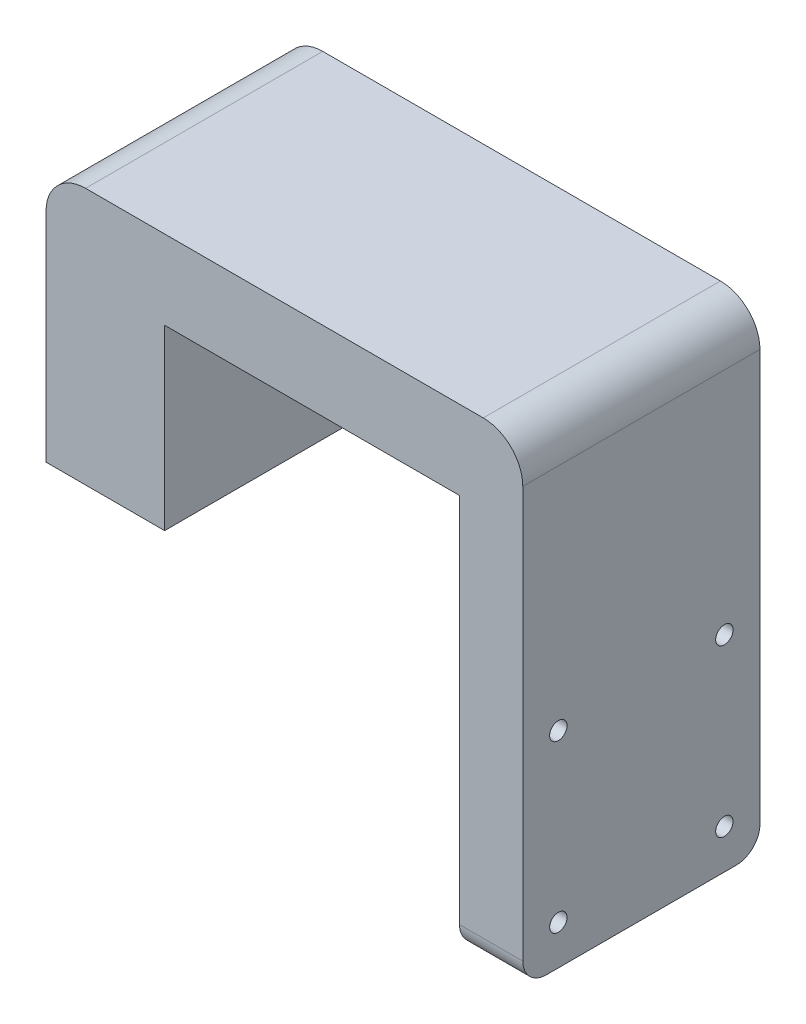
ISO-10303-21;
HEADER;
FILE_DESCRIPTION(('STEP AP214'),'2;1');
FILE_NAME('part.step','',(''),(''),'','','');
FILE_SCHEMA(('AUTOMOTIVE_DESIGN { 1 0 10303 214 1 1 1 1 }'));
ENDSEC;
DATA;
#1=APPLICATION_CONTEXT('core data for automotive mechanical design processes');
#2=APPLICATION_PROTOCOL_DEFINITION('international standard','automotive_design',2000,#1);
#3=PRODUCT_CONTEXT('',#1,'mechanical');
#4=PRODUCT('Part','Part','',(#3));
#5=PRODUCT_RELATED_PRODUCT_CATEGORY('part','',(#4));
#6=PRODUCT_DEFINITION_FORMATION('','',#4);
#7=PRODUCT_DEFINITION_CONTEXT('part definition',#1,'design');
#8=PRODUCT_DEFINITION('design','',#6,#7);
#9=PRODUCT_DEFINITION_SHAPE('','',#8);
#10=(LENGTH_UNIT() NAMED_UNIT(*) SI_UNIT(.MILLI.,.METRE.));
#11=(NAMED_UNIT(*) PLANE_ANGLE_UNIT() SI_UNIT($,.RADIAN.));
#12=(NAMED_UNIT(*) SI_UNIT($,.STERADIAN.) SOLID_ANGLE_UNIT());
#13=UNCERTAINTY_MEASURE_WITH_UNIT(LENGTH_MEASURE(1.E-05),#10,'distance_accuracy_value','');
#14=(GEOMETRIC_REPRESENTATION_CONTEXT(3) GLOBAL_UNCERTAINTY_ASSIGNED_CONTEXT((#13)) GLOBAL_UNIT_ASSIGNED_CONTEXT((#10,
#11,#12)) REPRESENTATION_CONTEXT('',''));
#15=CARTESIAN_POINT('',(0.,0.,0.));
#16=DIRECTION('',(0.,0.,1.));
#17=DIRECTION('',(1.,0.,0.));
#18=AXIS2_PLACEMENT_3D('',#15,#16,#17);
#19=CARTESIAN_POINT('',(45.3,-22.5,4.5));
#20=DIRECTION('',(-1.,0.,0.));
#21=DIRECTION('',(0.,-1.,0.));
#22=AXIS2_PLACEMENT_3D('',#19,#20,#21);
#23=CYLINDRICAL_SURFACE('',#22,1.1);
#24=CARTESIAN_POINT('',(45.3,-22.5,4.5));
#25=DIRECTION('',(-1.,0.,0.));
#26=DIRECTION('',(0.,-1.,0.));
#27=AXIS2_PLACEMENT_3D('',#24,#25,#26);
#28=CIRCLE('',#27,1.1);
#29=CARTESIAN_POINT('',(45.3,-23.6,4.5));
#30=VERTEX_POINT('',#29);
#31=EDGE_CURVE('E175',#30,#30,#28,.T.);
#32=ORIENTED_EDGE('',*,*,#31,.F.);
#33=EDGE_LOOP('',(#32));
#34=FACE_BOUND('',#33,.T.);
#35=CARTESIAN_POINT('',(42.3,-22.5,4.5));
#36=DIRECTION('',(-1.,0.,0.));
#37=DIRECTION('',(0.,-1.,0.));
#38=AXIS2_PLACEMENT_3D('',#35,#36,#37);
#39=CIRCLE('',#38,1.1);
#40=CARTESIAN_POINT('',(42.3,-23.6,4.5));
#41=VERTEX_POINT('',#40);
#42=EDGE_CURVE('E39',#41,#41,#39,.F.);
#43=ORIENTED_EDGE('',*,*,#42,.F.);
#44=EDGE_LOOP('',(#43));
#45=FACE_BOUND('',#44,.T.);
#46=ADVANCED_FACE('F35',(#34,#45),#23,.F.);
#47=CARTESIAN_POINT('',(45.3,-1.49999999999999,25.4999999999999));
#48=DIRECTION('',(-1.,0.,0.));
#49=DIRECTION('',(0.,-1.,0.));
#50=AXIS2_PLACEMENT_3D('',#47,#48,#49);
#51=CYLINDRICAL_SURFACE('',#50,1.1);
#52=CARTESIAN_POINT('',(45.3,-1.49999999999999,25.4999999999999));
#53=DIRECTION('',(-1.,0.,0.));
#54=DIRECTION('',(0.,-1.,0.));
#55=AXIS2_PLACEMENT_3D('',#52,#53,#54);
#56=CIRCLE('',#55,1.1);
#57=CARTESIAN_POINT('',(45.3,-2.59999999999999,25.4999999999999));
#58=VERTEX_POINT('',#57);
#59=EDGE_CURVE('E235',#58,#58,#56,.T.);
#60=ORIENTED_EDGE('',*,*,#59,.F.);
#61=EDGE_LOOP('',(#60));
#62=FACE_BOUND('',#61,.T.);
#63=CARTESIAN_POINT('',(42.3,-1.5,25.4999999999999));
#64=DIRECTION('',(-1.,0.,0.));
#65=DIRECTION('',(0.,-1.,0.));
#66=AXIS2_PLACEMENT_3D('',#63,#64,#65);
#67=CIRCLE('',#66,1.1);
#68=CARTESIAN_POINT('',(42.3,-2.59999999999999,25.4999999999999));
#69=VERTEX_POINT('',#68);
#70=EDGE_CURVE('E230',#69,#69,#67,.F.);
#71=ORIENTED_EDGE('',*,*,#70,.F.);
#72=EDGE_LOOP('',(#71));
#73=FACE_BOUND('',#72,.T.);
#74=ADVANCED_FACE('F258',(#62,#73),#51,.F.);
#75=CARTESIAN_POINT('',(45.3,-1.49999999999999,4.4999999999999));
#76=DIRECTION('',(-1.,0.,0.));
#77=DIRECTION('',(0.,-1.,0.));
#78=AXIS2_PLACEMENT_3D('',#75,#76,#77);
#79=CYLINDRICAL_SURFACE('',#78,1.1);
#80=CARTESIAN_POINT('',(45.3,-1.49999999999999,4.4999999999999));
#81=DIRECTION('',(-1.,0.,0.));
#82=DIRECTION('',(0.,-1.,0.));
#83=AXIS2_PLACEMENT_3D('',#80,#81,#82);
#84=CIRCLE('',#83,1.1);
#85=CARTESIAN_POINT('',(45.3,-2.59999999999999,4.4999999999999));
#86=VERTEX_POINT('',#85);
#87=EDGE_CURVE('E239',#86,#86,#84,.T.);
#88=ORIENTED_EDGE('',*,*,#87,.F.);
#89=EDGE_LOOP('',(#88));
#90=FACE_BOUND('',#89,.T.);
#91=CARTESIAN_POINT('',(42.3,-1.5,4.4999999999999));
#92=DIRECTION('',(-1.,0.,0.));
#93=DIRECTION('',(0.,-1.,0.));
#94=AXIS2_PLACEMENT_3D('',#91,#92,#93);
#95=CIRCLE('',#94,1.1);
#96=CARTESIAN_POINT('',(42.3,-2.59999999999999,4.4999999999999));
#97=VERTEX_POINT('',#96);
#98=EDGE_CURVE('E227',#97,#97,#95,.F.);
#99=ORIENTED_EDGE('',*,*,#98,.F.);
#100=EDGE_LOOP('',(#99));
#101=FACE_BOUND('',#100,.T.);
#102=ADVANCED_FACE('F263',(#90,#101),#79,.F.);
#103=CARTESIAN_POINT('',(45.3,-22.5,25.5));
#104=DIRECTION('',(-1.,0.,0.));
#105=DIRECTION('',(0.,-1.,0.));
#106=AXIS2_PLACEMENT_3D('',#103,#104,#105);
#107=CYLINDRICAL_SURFACE('',#106,1.1);
#108=CARTESIAN_POINT('',(45.3,-22.5,25.5));
#109=DIRECTION('',(-1.,0.,0.));
#110=DIRECTION('',(0.,-1.,0.));
#111=AXIS2_PLACEMENT_3D('',#108,#109,#110);
#112=CIRCLE('',#111,1.1);
#113=CARTESIAN_POINT('',(45.3,-23.6,25.5));
#114=VERTEX_POINT('',#113);
#115=EDGE_CURVE('E244',#114,#114,#112,.T.);
#116=ORIENTED_EDGE('',*,*,#115,.F.);
#117=EDGE_LOOP('',(#116));
#118=FACE_BOUND('',#117,.T.);
#119=CARTESIAN_POINT('',(42.3,-22.5,25.5));
#120=DIRECTION('',(-1.,0.,0.));
#121=DIRECTION('',(0.,-1.,0.));
#122=AXIS2_PLACEMENT_3D('',#119,#120,#121);
#123=CIRCLE('',#122,1.1);
#124=CARTESIAN_POINT('',(42.3,-23.6,25.5));
#125=VERTEX_POINT('',#124);
#126=EDGE_CURVE('E224',#125,#125,#123,.F.);
#127=ORIENTED_EDGE('',*,*,#126,.F.);
#128=EDGE_LOOP('',(#127));
#129=FACE_BOUND('',#128,.T.);
#130=ADVANCED_FACE('F310',(#118,#129),#107,.F.);
#131=CARTESIAN_POINT('',(-10.,27.5,30.));
#132=DIRECTION('',(0.,0.,-1.));
#133=DIRECTION('',(-1.,0.,0.));
#134=AXIS2_PLACEMENT_3D('',#131,#132,#133);
#135=CYLINDRICAL_SURFACE('',#134,5.);
#136=CARTESIAN_POINT('',(-10.,27.5,0.));
#137=DIRECTION('',(0.,0.,1.));
#138=DIRECTION('',(1.,0.,0.));
#139=AXIS2_PLACEMENT_3D('',#136,#137,#138);
#140=CIRCLE('',#139,5.);
#141=CARTESIAN_POINT('',(-15.,27.5,0.));
#142=VERTEX_POINT('',#141);
#143=CARTESIAN_POINT('',(-10.,32.5,0.));
#144=VERTEX_POINT('',#143);
#145=EDGE_CURVE('E136',#142,#144,#140,.F.);
#146=ORIENTED_EDGE('',*,*,#145,.F.);
#147=DIRECTION('',(0.,0.,-1.));
#148=VECTOR('',#147,1.);
#149=CARTESIAN_POINT('',(-15.,27.5,30.));
#150=LINE('',#149,#148);
#151=CARTESIAN_POINT('',(-15.,27.5,30.));
#152=VERTEX_POINT('',#151);
#153=EDGE_CURVE('E130',#152,#142,#150,.T.);
#154=ORIENTED_EDGE('',*,*,#153,.F.);
#155=CARTESIAN_POINT('',(-10.,27.5,30.));
#156=DIRECTION('',(0.,0.,1.));
#157=DIRECTION('',(1.,0.,0.));
#158=AXIS2_PLACEMENT_3D('',#155,#156,#157);
#159=CIRCLE('',#158,5.);
#160=CARTESIAN_POINT('',(-10.,32.5,30.));
#161=VERTEX_POINT('',#160);
#162=EDGE_CURVE('E133',#152,#161,#159,.F.);
#163=ORIENTED_EDGE('',*,*,#162,.T.);
#164=DIRECTION('',(0.,0.,-1.));
#165=VECTOR('',#164,1.);
#166=CARTESIAN_POINT('',(-10.,32.5,30.));
#167=LINE('',#166,#165);
#168=EDGE_CURVE('E172',#161,#144,#167,.T.);
#169=ORIENTED_EDGE('',*,*,#168,.T.);
#170=EDGE_LOOP('',(#146,#154,#163,#169));
#171=FACE_BOUND('',#170,.T.);
#172=ADVANCED_FACE('F132',(#171),#135,.T.);
#173=CARTESIAN_POINT('',(-15.,0.,30.));
#174=DIRECTION('',(-1.,0.,0.));
#175=DIRECTION('',(0.,0.,1.));
#176=AXIS2_PLACEMENT_3D('',#173,#174,#175);
#177=PLANE('',#176);
#178=DIRECTION('',(0.,1.,0.));
#179=VECTOR('',#178,1.);
#180=CARTESIAN_POINT('',(-15.,0.,0.));
#181=LINE('',#180,#179);
#182=CARTESIAN_POINT('',(-15.,0.,0.));
#183=VERTEX_POINT('',#182);
#184=EDGE_CURVE('E174',#183,#142,#181,.T.);
#185=ORIENTED_EDGE('',*,*,#184,.F.);
#186=DIRECTION('',(0.,0.,-1.));
#187=VECTOR('',#186,1.);
#188=CARTESIAN_POINT('',(-15.,0.,30.));
#189=LINE('',#188,#187);
#190=CARTESIAN_POINT('',(-15.,0.,30.));
#191=VERTEX_POINT('',#190);
#192=EDGE_CURVE('E142',#191,#183,#189,.T.);
#193=ORIENTED_EDGE('',*,*,#192,.F.);
#194=DIRECTION('',(0.,1.,0.));
#195=VECTOR('',#194,1.);
#196=CARTESIAN_POINT('',(-15.,0.,30.));
#197=LINE('',#196,#195);
#198=EDGE_CURVE('E147',#191,#152,#197,.T.);
#199=ORIENTED_EDGE('',*,*,#198,.T.);
#200=ORIENTED_EDGE('',*,*,#153,.T.);
#201=EDGE_LOOP('',(#185,#193,#199,#200));
#202=FACE_BOUND('',#201,.T.);
#203=ADVANCED_FACE('F154',(#202),#177,.T.);
#204=CARTESIAN_POINT('',(0.,0.,30.));
#205=DIRECTION('',(0.,-1.,0.));
#206=DIRECTION('',(1.,0.,0.));
#207=AXIS2_PLACEMENT_3D('',#204,#205,#206);
#208=PLANE('',#207);
#209=DIRECTION('',(-1.,0.,0.));
#210=VECTOR('',#209,1.);
#211=CARTESIAN_POINT('',(0.,0.,0.));
#212=LINE('',#211,#210);
#213=CARTESIAN_POINT('',(0.,0.,0.));
#214=VERTEX_POINT('',#213);
#215=EDGE_CURVE('E177',#214,#183,#212,.T.);
#216=ORIENTED_EDGE('',*,*,#215,.F.);
#217=DIRECTION('',(0.,0.,-1.));
#218=VECTOR('',#217,1.);
#219=CARTESIAN_POINT('',(0.,0.,30.));
#220=LINE('',#219,#218);
#221=CARTESIAN_POINT('',(0.,0.,30.));
#222=VERTEX_POINT('',#221);
#223=EDGE_CURVE('E210',#222,#214,#220,.T.);
#224=ORIENTED_EDGE('',*,*,#223,.F.);
#225=DIRECTION('',(-1.,0.,0.));
#226=VECTOR('',#225,1.);
#227=CARTESIAN_POINT('',(0.,0.,30.));
#228=LINE('',#227,#226);
#229=EDGE_CURVE('E155',#222,#191,#228,.T.);
#230=ORIENTED_EDGE('',*,*,#229,.T.);
#231=ORIENTED_EDGE('',*,*,#192,.T.);
#232=EDGE_LOOP('',(#216,#224,#230,#231));
#233=FACE_BOUND('',#232,.T.);
#234=ADVANCED_FACE('F302',(#233),#208,.T.);
#235=CARTESIAN_POINT('',(0.,0.,30.));
#236=DIRECTION('',(-1.,0.,0.));
#237=DIRECTION('',(0.,0.,1.));
#238=AXIS2_PLACEMENT_3D('',#235,#236,#237);
#239=PLANE('',#238);
#240=DIRECTION('',(0.,1.,0.));
#241=VECTOR('',#240,1.);
#242=CARTESIAN_POINT('',(0.,0.,0.));
#243=LINE('',#242,#241);
#244=CARTESIAN_POINT('',(0.,22.5,0.));
#245=VERTEX_POINT('',#244);
#246=EDGE_CURVE('E180',#214,#245,#243,.T.);
#247=ORIENTED_EDGE('',*,*,#246,.T.);
#248=DIRECTION('',(0.,0.,-1.));
#249=VECTOR('',#248,1.);
#250=CARTESIAN_POINT('',(0.,22.5,30.));
#251=LINE('',#250,#249);
#252=CARTESIAN_POINT('',(0.,22.5,30.));
#253=VERTEX_POINT('',#252);
#254=EDGE_CURVE('E207',#253,#245,#251,.T.);
#255=ORIENTED_EDGE('',*,*,#254,.F.);
#256=DIRECTION('',(0.,1.,0.));
#257=VECTOR('',#256,1.);
#258=CARTESIAN_POINT('',(0.,0.,30.));
#259=LINE('',#258,#257);
#260=EDGE_CURVE('E157',#222,#253,#259,.T.);
#261=ORIENTED_EDGE('',*,*,#260,.F.);
#262=ORIENTED_EDGE('',*,*,#223,.T.);
#263=EDGE_LOOP('',(#247,#255,#261,#262));
#264=FACE_BOUND('',#263,.T.);
#265=ADVANCED_FACE('F298',(#264),#239,.F.);
#266=CARTESIAN_POINT('',(0.,22.5,30.));
#267=DIRECTION('',(0.,1.,0.));
#268=DIRECTION('',(0.,0.,1.));
#269=AXIS2_PLACEMENT_3D('',#266,#267,#268);
#270=PLANE('',#269);
#271=DIRECTION('',(1.,0.,0.));
#272=VECTOR('',#271,1.);
#273=CARTESIAN_POINT('',(0.,22.5,0.));
#274=LINE('',#273,#272);
#275=CARTESIAN_POINT('',(37.3,22.5,0.));
#276=VERTEX_POINT('',#275);
#277=EDGE_CURVE('E182',#245,#276,#274,.T.);
#278=ORIENTED_EDGE('',*,*,#277,.T.);
#279=DIRECTION('',(0.,0.,-1.));
#280=VECTOR('',#279,1.);
#281=CARTESIAN_POINT('',(37.3,22.5,30.));
#282=LINE('',#281,#280);
#283=CARTESIAN_POINT('',(37.3,22.5,30.));
#284=VERTEX_POINT('',#283);
#285=EDGE_CURVE('E204',#284,#276,#282,.T.);
#286=ORIENTED_EDGE('',*,*,#285,.F.);
#287=DIRECTION('',(1.,0.,0.));
#288=VECTOR('',#287,1.);
#289=CARTESIAN_POINT('',(0.,22.5,30.));
#290=LINE('',#289,#288);
#291=EDGE_CURVE('E162',#253,#284,#290,.T.);
#292=ORIENTED_EDGE('',*,*,#291,.F.);
#293=ORIENTED_EDGE('',*,*,#254,.T.);
#294=EDGE_LOOP('',(#278,#286,#292,#293));
#295=FACE_BOUND('',#294,.T.);
#296=ADVANCED_FACE('F294',(#295),#270,.F.);
#297=CARTESIAN_POINT('',(37.3,0.,30.));
#298=DIRECTION('',(1.,0.,0.));
#299=DIRECTION('',(0.,1.,0.));
#300=AXIS2_PLACEMENT_3D('',#297,#298,#299);
#301=PLANE('',#300);
#302=CARTESIAN_POINT('',(37.3,-22.5,25.5));
#303=DIRECTION('',(-1.,0.,0.));
#304=DIRECTION('',(0.,-1.,0.));
#305=AXIS2_PLACEMENT_3D('',#302,#303,#304);
#306=CIRCLE('',#305,3.25);
#307=CARTESIAN_POINT('',(37.3,-25.75,25.5));
#308=VERTEX_POINT('',#307);
#309=EDGE_CURVE('E543',#308,#308,#306,.T.);
#310=ORIENTED_EDGE('',*,*,#309,.F.);
#311=EDGE_LOOP('',(#310));
#312=FACE_BOUND('',#311,.T.);
#313=CARTESIAN_POINT('',(37.3,-1.5,4.4999999999999));
#314=DIRECTION('',(-1.,0.,0.));
#315=DIRECTION('',(0.,-1.,0.));
#316=AXIS2_PLACEMENT_3D('',#313,#314,#315);
#317=CIRCLE('',#316,3.25);
#318=CARTESIAN_POINT('',(37.3,-4.75,4.4999999999999));
#319=VERTEX_POINT('',#318);
#320=EDGE_CURVE('E538',#319,#319,#317,.T.);
#321=ORIENTED_EDGE('',*,*,#320,.F.);
#322=EDGE_LOOP('',(#321));
#323=FACE_BOUND('',#322,.T.);
#324=CARTESIAN_POINT('',(37.3,-1.5,25.4999999999999));
#325=DIRECTION('',(-1.,0.,0.));
#326=DIRECTION('',(0.,-1.,0.));
#327=AXIS2_PLACEMENT_3D('',#324,#325,#326);
#328=CIRCLE('',#327,3.25);
#329=CARTESIAN_POINT('',(37.3,-4.75,25.4999999999999));
#330=VERTEX_POINT('',#329);
#331=EDGE_CURVE('E535',#330,#330,#328,.T.);
#332=ORIENTED_EDGE('',*,*,#331,.F.);
#333=EDGE_LOOP('',(#332));
#334=FACE_BOUND('',#333,.T.);
#335=CARTESIAN_POINT('',(37.3,-22.5,4.5));
#336=DIRECTION('',(-1.,0.,0.));
#337=DIRECTION('',(0.,-1.,0.));
#338=AXIS2_PLACEMENT_3D('',#335,#336,#337);
#339=CIRCLE('',#338,3.25);
#340=CARTESIAN_POINT('',(37.3,-25.75,4.5));
#341=VERTEX_POINT('',#340);
#342=EDGE_CURVE('E248',#341,#341,#339,.T.);
#343=ORIENTED_EDGE('',*,*,#342,.F.);
#344=EDGE_LOOP('',(#343));
#345=FACE_BOUND('',#344,.T.);
#346=DIRECTION('',(0.,0.,-1.));
#347=VECTOR('',#346,1.);
#348=CARTESIAN_POINT('',(37.3,-27.5,30.));
#349=LINE('',#348,#347);
#350=CARTESIAN_POINT('',(37.3,-27.5,27.));
#351=VERTEX_POINT('',#350);
#352=CARTESIAN_POINT('',(37.3,-27.5,3.));
#353=VERTEX_POINT('',#352);
#354=EDGE_CURVE('E201',#351,#353,#349,.T.);
#355=ORIENTED_EDGE('',*,*,#354,.F.);
#356=CARTESIAN_POINT('',(37.3,-24.5,27.));
#357=DIRECTION('',(1.,0.,0.));
#358=DIRECTION('',(0.,1.,0.));
#359=AXIS2_PLACEMENT_3D('',#356,#357,#358);
#360=CIRCLE('',#359,3.);
#361=CARTESIAN_POINT('',(37.3,-24.5,30.));
#362=VERTEX_POINT('',#361);
#363=EDGE_CURVE('E219',#351,#362,#360,.F.);
#364=ORIENTED_EDGE('',*,*,#363,.T.);
#365=DIRECTION('',(0.,-1.,0.));
#366=VECTOR('',#365,1.);
#367=CARTESIAN_POINT('',(37.3,0.,30.));
#368=LINE('',#367,#366);
#369=EDGE_CURVE('E164',#284,#362,#368,.T.);
#370=ORIENTED_EDGE('',*,*,#369,.F.);
#371=ORIENTED_EDGE('',*,*,#285,.T.);
#372=DIRECTION('',(0.,-1.,0.));
#373=VECTOR('',#372,1.);
#374=CARTESIAN_POINT('',(37.3,0.,0.));
#375=LINE('',#374,#373);
#376=CARTESIAN_POINT('',(37.3,-24.5,0.));
#377=VERTEX_POINT('',#376);
#378=EDGE_CURVE('E184',#276,#377,#375,.T.);
#379=ORIENTED_EDGE('',*,*,#378,.T.);
#380=CARTESIAN_POINT('',(37.3,-24.5,3.));
#381=DIRECTION('',(1.,0.,0.));
#382=DIRECTION('',(0.,1.,0.));
#383=AXIS2_PLACEMENT_3D('',#380,#381,#382);
#384=CIRCLE('',#383,3.);
#385=EDGE_CURVE('E217',#377,#353,#384,.F.);
#386=ORIENTED_EDGE('',*,*,#385,.T.);
#387=EDGE_LOOP('',(#355,#364,#370,#371,#379,#386));
#388=FACE_BOUND('',#387,.T.);
#389=ADVANCED_FACE('F290',(#312,#323,#334,#345,#388),#301,.F.);
#390=CARTESIAN_POINT('',(0.,-27.5,30.));
#391=DIRECTION('',(0.,-1.,0.));
#392=DIRECTION('',(0.,0.,-1.));
#393=AXIS2_PLACEMENT_3D('',#390,#391,#392);
#394=PLANE('',#393);
#395=DIRECTION('',(0.,0.,-1.));
#396=VECTOR('',#395,1.);
#397=CARTESIAN_POINT('',(45.3,-27.5,30.));
#398=LINE('',#397,#396);
#399=CARTESIAN_POINT('',(45.3,-27.5,27.));
#400=VERTEX_POINT('',#399);
#401=CARTESIAN_POINT('',(45.3,-27.5,3.));
#402=VERTEX_POINT('',#401);
#403=EDGE_CURVE('E199',#400,#402,#398,.T.);
#404=ORIENTED_EDGE('',*,*,#403,.F.);
#405=DIRECTION('',(-1.,0.,0.));
#406=VECTOR('',#405,1.);
#407=CARTESIAN_POINT('',(0.,-27.5,27.));
#408=LINE('',#407,#406);
#409=EDGE_CURVE('E214',#400,#351,#408,.T.);
#410=ORIENTED_EDGE('',*,*,#409,.T.);
#411=ORIENTED_EDGE('',*,*,#354,.T.);
#412=DIRECTION('',(-1.,0.,0.));
#413=VECTOR('',#412,1.);
#414=CARTESIAN_POINT('',(45.3,-27.5,3.));
#415=LINE('',#414,#413);
#416=EDGE_CURVE('E141',#353,#402,#415,.F.);
#417=ORIENTED_EDGE('',*,*,#416,.T.);
#418=EDGE_LOOP('',(#404,#410,#411,#417));
#419=FACE_BOUND('',#418,.T.);
#420=ADVANCED_FACE('F286',(#419),#394,.T.);
#421=CARTESIAN_POINT('',(45.3,0.,30.));
#422=DIRECTION('',(1.,0.,0.));
#423=DIRECTION('',(0.,1.,0.));
#424=AXIS2_PLACEMENT_3D('',#421,#422,#423);
#425=PLANE('',#424);
#426=ORIENTED_EDGE('',*,*,#115,.T.);
#427=EDGE_LOOP('',(#426));
#428=FACE_BOUND('',#427,.T.);
#429=ORIENTED_EDGE('',*,*,#87,.T.);
#430=EDGE_LOOP('',(#429));
#431=FACE_BOUND('',#430,.T.);
#432=ORIENTED_EDGE('',*,*,#59,.T.);
#433=EDGE_LOOP('',(#432));
#434=FACE_BOUND('',#433,.T.);
#435=ORIENTED_EDGE('',*,*,#31,.T.);
#436=EDGE_LOOP('',(#435));
#437=FACE_BOUND('',#436,.T.);
#438=DIRECTION('',(0.,-1.,0.));
#439=VECTOR('',#438,1.);
#440=CARTESIAN_POINT('',(45.3,0.,30.));
#441=LINE('',#440,#439);
#442=CARTESIAN_POINT('',(45.3,27.5,30.));
#443=VERTEX_POINT('',#442);
#444=CARTESIAN_POINT('',(45.3,-24.5,30.));
#445=VERTEX_POINT('',#444);
#446=EDGE_CURVE('E166',#443,#445,#441,.T.);
#447=ORIENTED_EDGE('',*,*,#446,.T.);
#448=CARTESIAN_POINT('',(45.3,-24.5,27.));
#449=DIRECTION('',(1.,0.,0.));
#450=DIRECTION('',(0.,1.,0.));
#451=AXIS2_PLACEMENT_3D('',#448,#449,#450);
#452=CIRCLE('',#451,3.);
#453=EDGE_CURVE('E44',#445,#400,#452,.T.);
#454=ORIENTED_EDGE('',*,*,#453,.T.);
#455=ORIENTED_EDGE('',*,*,#403,.T.);
#456=CARTESIAN_POINT('',(45.3,-24.5,3.));
#457=DIRECTION('',(1.,0.,0.));
#458=DIRECTION('',(0.,1.,0.));
#459=AXIS2_PLACEMENT_3D('',#456,#457,#458);
#460=CIRCLE('',#459,3.);
#461=CARTESIAN_POINT('',(45.3,-24.5,0.));
#462=VERTEX_POINT('',#461);
#463=EDGE_CURVE('E52',#402,#462,#460,.T.);
#464=ORIENTED_EDGE('',*,*,#463,.T.);
#465=DIRECTION('',(0.,-1.,0.));
#466=VECTOR('',#465,1.);
#467=CARTESIAN_POINT('',(45.3,0.,0.));
#468=LINE('',#467,#466);
#469=CARTESIAN_POINT('',(45.3,27.5,0.));
#470=VERTEX_POINT('',#469);
#471=EDGE_CURVE('E187',#470,#462,#468,.T.);
#472=ORIENTED_EDGE('',*,*,#471,.F.);
#473=DIRECTION('',(0.,0.,-1.));
#474=VECTOR('',#473,1.);
#475=CARTESIAN_POINT('',(45.3,27.5,30.));
#476=LINE('',#475,#474);
#477=EDGE_CURVE('E197',#443,#470,#476,.T.);
#478=ORIENTED_EDGE('',*,*,#477,.F.);
#479=EDGE_LOOP('',(#447,#454,#455,#464,#472,#478));
#480=FACE_BOUND('',#479,.T.);
#481=ADVANCED_FACE('F254',(#428,#431,#434,#437,#480),#425,.T.);
#482=CARTESIAN_POINT('',(40.3,27.5,30.));
#483=DIRECTION('',(0.,0.,-1.));
#484=DIRECTION('',(-1.,0.,0.));
#485=AXIS2_PLACEMENT_3D('',#482,#483,#484);
#486=CYLINDRICAL_SURFACE('',#485,5.);
#487=CARTESIAN_POINT('',(40.3,27.5,0.));
#488=DIRECTION('',(0.,0.,1.));
#489=DIRECTION('',(1.,0.,0.));
#490=AXIS2_PLACEMENT_3D('',#487,#488,#489);
#491=CIRCLE('',#490,5.);
#492=CARTESIAN_POINT('',(40.3,32.5,0.));
#493=VERTEX_POINT('',#492);
#494=EDGE_CURVE('E189',#493,#470,#491,.F.);
#495=ORIENTED_EDGE('',*,*,#494,.F.);
#496=DIRECTION('',(0.,0.,-1.));
#497=VECTOR('',#496,1.);
#498=CARTESIAN_POINT('',(40.3,32.5,30.));
#499=LINE('',#498,#497);
#500=CARTESIAN_POINT('',(40.3,32.5,30.));
#501=VERTEX_POINT('',#500);
#502=EDGE_CURVE('E195',#501,#493,#499,.T.);
#503=ORIENTED_EDGE('',*,*,#502,.F.);
#504=CARTESIAN_POINT('',(40.3,27.5,30.));
#505=DIRECTION('',(0.,0.,1.));
#506=DIRECTION('',(1.,0.,0.));
#507=AXIS2_PLACEMENT_3D('',#504,#505,#506);
#508=CIRCLE('',#507,5.);
#509=EDGE_CURVE('E168',#501,#443,#508,.F.);
#510=ORIENTED_EDGE('',*,*,#509,.T.);
#511=ORIENTED_EDGE('',*,*,#477,.T.);
#512=EDGE_LOOP('',(#495,#503,#510,#511));
#513=FACE_BOUND('',#512,.T.);
#514=ADVANCED_FACE('F279',(#513),#486,.T.);
#515=CARTESIAN_POINT('',(0.,32.5,30.));
#516=DIRECTION('',(0.,1.,0.));
#517=DIRECTION('',(-1.,0.,0.));
#518=AXIS2_PLACEMENT_3D('',#515,#516,#517);
#519=PLANE('',#518);
#520=DIRECTION('',(1.,0.,0.));
#521=VECTOR('',#520,1.);
#522=CARTESIAN_POINT('',(0.,32.5,0.));
#523=LINE('',#522,#521);
#524=EDGE_CURVE('E152',#144,#493,#523,.T.);
#525=ORIENTED_EDGE('',*,*,#524,.F.);
#526=ORIENTED_EDGE('',*,*,#168,.F.);
#527=DIRECTION('',(1.,0.,0.));
#528=VECTOR('',#527,1.);
#529=CARTESIAN_POINT('',(0.,32.5,30.));
#530=LINE('',#529,#528);
#531=EDGE_CURVE('E151',#161,#501,#530,.T.);
#532=ORIENTED_EDGE('',*,*,#531,.T.);
#533=ORIENTED_EDGE('',*,*,#502,.T.);
#534=EDGE_LOOP('',(#525,#526,#532,#533));
#535=FACE_BOUND('',#534,.T.);
#536=ADVANCED_FACE('F272',(#535),#519,.T.);
#537=CARTESIAN_POINT('',(0.,0.,30.));
#538=DIRECTION('',(0.,0.,1.));
#539=DIRECTION('',(1.,0.,0.));
#540=AXIS2_PLACEMENT_3D('',#537,#538,#539);
#541=PLANE('',#540);
#542=ORIENTED_EDGE('',*,*,#369,.T.);
#543=DIRECTION('',(-1.,0.,0.));
#544=VECTOR('',#543,1.);
#545=CARTESIAN_POINT('',(0.,-24.5,30.));
#546=LINE('',#545,#544);
#547=EDGE_CURVE('E60',#362,#445,#546,.F.);
#548=ORIENTED_EDGE('',*,*,#547,.T.);
#549=ORIENTED_EDGE('',*,*,#446,.F.);
#550=ORIENTED_EDGE('',*,*,#509,.F.);
#551=ORIENTED_EDGE('',*,*,#531,.F.);
#552=ORIENTED_EDGE('',*,*,#162,.F.);
#553=ORIENTED_EDGE('',*,*,#198,.F.);
#554=ORIENTED_EDGE('',*,*,#229,.F.);
#555=ORIENTED_EDGE('',*,*,#260,.T.);
#556=ORIENTED_EDGE('',*,*,#291,.T.);
#557=EDGE_LOOP('',(#542,#548,#549,#550,#551,#552,#553,#554,#555,#556));
#558=FACE_BOUND('',#557,.T.);
#559=ADVANCED_FACE('F145',(#558),#541,.T.);
#560=CARTESIAN_POINT('',(0.,0.,0.));
#561=DIRECTION('',(0.,0.,1.));
#562=DIRECTION('',(1.,0.,0.));
#563=AXIS2_PLACEMENT_3D('',#560,#561,#562);
#564=PLANE('',#563);
#565=ORIENTED_EDGE('',*,*,#471,.T.);
#566=DIRECTION('',(-1.,0.,0.));
#567=VECTOR('',#566,1.);
#568=CARTESIAN_POINT('',(37.3,-24.5,0.));
#569=LINE('',#568,#567);
#570=EDGE_CURVE('E11',#462,#377,#569,.T.);
#571=ORIENTED_EDGE('',*,*,#570,.T.);
#572=ORIENTED_EDGE('',*,*,#378,.F.);
#573=ORIENTED_EDGE('',*,*,#277,.F.);
#574=ORIENTED_EDGE('',*,*,#246,.F.);
#575=ORIENTED_EDGE('',*,*,#215,.T.);
#576=ORIENTED_EDGE('',*,*,#184,.T.);
#577=ORIENTED_EDGE('',*,*,#145,.T.);
#578=ORIENTED_EDGE('',*,*,#524,.T.);
#579=ORIENTED_EDGE('',*,*,#494,.T.);
#580=EDGE_LOOP('',(#565,#571,#572,#573,#574,#575,#576,#577,#578,#579));
#581=FACE_BOUND('',#580,.T.);
#582=ADVANCED_FACE('F271',(#581),#564,.F.);
#583=CARTESIAN_POINT('',(0.,-24.5,27.));
#584=DIRECTION('',(-1.,0.,0.));
#585=DIRECTION('',(0.,0.,1.));
#586=AXIS2_PLACEMENT_3D('',#583,#584,#585);
#587=CYLINDRICAL_SURFACE('',#586,3.);
#588=ORIENTED_EDGE('',*,*,#453,.F.);
#589=ORIENTED_EDGE('',*,*,#547,.F.);
#590=ORIENTED_EDGE('',*,*,#363,.F.);
#591=ORIENTED_EDGE('',*,*,#409,.F.);
#592=EDGE_LOOP('',(#588,#589,#590,#591));
#593=FACE_BOUND('',#592,.T.);
#594=ADVANCED_FACE('F275',(#593),#587,.T.);
#595=CARTESIAN_POINT('',(0.,-24.5,3.));
#596=DIRECTION('',(1.,0.,0.));
#597=DIRECTION('',(0.,0.,-1.));
#598=AXIS2_PLACEMENT_3D('',#595,#596,#597);
#599=CYLINDRICAL_SURFACE('',#598,3.);
#600=ORIENTED_EDGE('',*,*,#463,.F.);
#601=ORIENTED_EDGE('',*,*,#416,.F.);
#602=ORIENTED_EDGE('',*,*,#385,.F.);
#603=ORIENTED_EDGE('',*,*,#570,.F.);
#604=EDGE_LOOP('',(#600,#601,#602,#603));
#605=FACE_BOUND('',#604,.T.);
#606=ADVANCED_FACE('F37',(#605),#599,.T.);
#607=CARTESIAN_POINT('',(42.3,-22.5,25.5));
#608=DIRECTION('',(-1.,0.,0.));
#609=DIRECTION('',(0.,-1.,0.));
#610=AXIS2_PLACEMENT_3D('',#607,#608,#609);
#611=PLANE('',#610);
#612=CARTESIAN_POINT('',(42.3,-22.5,25.5));
#613=DIRECTION('',(-1.,0.,0.));
#614=DIRECTION('',(0.,-1.,0.));
#615=AXIS2_PLACEMENT_3D('',#612,#613,#614);
#616=CIRCLE('',#615,3.25);
#617=CARTESIAN_POINT('',(42.3,-25.75,25.5));
#618=VERTEX_POINT('',#617);
#619=EDGE_CURVE('E541',#618,#618,#616,.T.);
#620=ORIENTED_EDGE('',*,*,#619,.T.);
#621=EDGE_LOOP('',(#620));
#622=FACE_BOUND('',#621,.T.);
#623=ORIENTED_EDGE('',*,*,#126,.T.);
#624=EDGE_LOOP('',(#623));
#625=FACE_BOUND('',#624,.T.);
#626=ADVANCED_FACE('F316',(#622,#625),#611,.T.);
#627=CARTESIAN_POINT('',(42.3,-22.5,25.5));
#628=DIRECTION('',(-1.,0.,0.));
#629=DIRECTION('',(0.,-1.,0.));
#630=AXIS2_PLACEMENT_3D('',#627,#628,#629);
#631=CYLINDRICAL_SURFACE('',#630,3.25);
#632=ORIENTED_EDGE('',*,*,#619,.F.);
#633=EDGE_LOOP('',(#632));
#634=FACE_BOUND('',#633,.T.);
#635=ORIENTED_EDGE('',*,*,#309,.T.);
#636=EDGE_LOOP('',(#635));
#637=FACE_BOUND('',#636,.T.);
#638=ADVANCED_FACE('F339',(#634,#637),#631,.F.);
#639=CARTESIAN_POINT('',(42.3,-1.5,4.4999999999999));
#640=DIRECTION('',(-1.,0.,0.));
#641=DIRECTION('',(0.,-1.,0.));
#642=AXIS2_PLACEMENT_3D('',#639,#640,#641);
#643=PLANE('',#642);
#644=CARTESIAN_POINT('',(42.3,-1.5,4.4999999999999));
#645=DIRECTION('',(-1.,0.,0.));
#646=DIRECTION('',(0.,-1.,0.));
#647=AXIS2_PLACEMENT_3D('',#644,#645,#646);
#648=CIRCLE('',#647,3.25);
#649=CARTESIAN_POINT('',(42.3,-4.75,4.4999999999999));
#650=VERTEX_POINT('',#649);
#651=EDGE_CURVE('E546',#650,#650,#648,.T.);
#652=ORIENTED_EDGE('',*,*,#651,.T.);
#653=EDGE_LOOP('',(#652));
#654=FACE_BOUND('',#653,.T.);
#655=ORIENTED_EDGE('',*,*,#98,.T.);
#656=EDGE_LOOP('',(#655));
#657=FACE_BOUND('',#656,.T.);
#658=ADVANCED_FACE('F345',(#654,#657),#643,.T.);
#659=CARTESIAN_POINT('',(42.3,-1.5,4.4999999999999));
#660=DIRECTION('',(-1.,0.,0.));
#661=DIRECTION('',(0.,-1.,0.));
#662=AXIS2_PLACEMENT_3D('',#659,#660,#661);
#663=CYLINDRICAL_SURFACE('',#662,3.25);
#664=ORIENTED_EDGE('',*,*,#651,.F.);
#665=EDGE_LOOP('',(#664));
#666=FACE_BOUND('',#665,.T.);
#667=ORIENTED_EDGE('',*,*,#320,.T.);
#668=EDGE_LOOP('',(#667));
#669=FACE_BOUND('',#668,.T.);
#670=ADVANCED_FACE('F356',(#666,#669),#663,.F.);
#671=CARTESIAN_POINT('',(42.3,-1.5,25.4999999999999));
#672=DIRECTION('',(-1.,0.,0.));
#673=DIRECTION('',(0.,-1.,0.));
#674=AXIS2_PLACEMENT_3D('',#671,#672,#673);
#675=PLANE('',#674);
#676=CARTESIAN_POINT('',(42.3,-1.5,25.4999999999999));
#677=DIRECTION('',(-1.,0.,0.));
#678=DIRECTION('',(0.,-1.,0.));
#679=AXIS2_PLACEMENT_3D('',#676,#677,#678);
#680=CIRCLE('',#679,3.25);
#681=CARTESIAN_POINT('',(42.3,-4.75,25.4999999999999));
#682=VERTEX_POINT('',#681);
#683=EDGE_CURVE('E532',#682,#682,#680,.T.);
#684=ORIENTED_EDGE('',*,*,#683,.T.);
#685=EDGE_LOOP('',(#684));
#686=FACE_BOUND('',#685,.T.);
#687=ORIENTED_EDGE('',*,*,#70,.T.);
#688=EDGE_LOOP('',(#687));
#689=FACE_BOUND('',#688,.T.);
#690=ADVANCED_FACE('F360',(#686,#689),#675,.T.);
#691=CARTESIAN_POINT('',(42.3,-1.5,25.4999999999999));
#692=DIRECTION('',(-1.,0.,0.));
#693=DIRECTION('',(0.,-1.,0.));
#694=AXIS2_PLACEMENT_3D('',#691,#692,#693);
#695=CYLINDRICAL_SURFACE('',#694,3.25);
#696=ORIENTED_EDGE('',*,*,#683,.F.);
#697=EDGE_LOOP('',(#696));
#698=FACE_BOUND('',#697,.T.);
#699=ORIENTED_EDGE('',*,*,#331,.T.);
#700=EDGE_LOOP('',(#699));
#701=FACE_BOUND('',#700,.T.);
#702=ADVANCED_FACE('F351',(#698,#701),#695,.F.);
#703=CARTESIAN_POINT('',(42.3,-22.5,4.5));
#704=DIRECTION('',(-1.,0.,0.));
#705=DIRECTION('',(0.,-1.,0.));
#706=AXIS2_PLACEMENT_3D('',#703,#704,#705);
#707=PLANE('',#706);
#708=CARTESIAN_POINT('',(42.3,-22.5,4.5));
#709=DIRECTION('',(-1.,0.,0.));
#710=DIRECTION('',(0.,-1.,0.));
#711=AXIS2_PLACEMENT_3D('',#708,#709,#710);
#712=CIRCLE('',#711,3.25);
#713=CARTESIAN_POINT('',(42.3,-25.75,4.5));
#714=VERTEX_POINT('',#713);
#715=EDGE_CURVE('E228',#714,#714,#712,.T.);
#716=ORIENTED_EDGE('',*,*,#715,.T.);
#717=EDGE_LOOP('',(#716));
#718=FACE_BOUND('',#717,.T.);
#719=ORIENTED_EDGE('',*,*,#42,.T.);
#720=EDGE_LOOP('',(#719));
#721=FACE_BOUND('',#720,.T.);
#722=ADVANCED_FACE('F362',(#718,#721),#707,.T.);
#723=CARTESIAN_POINT('',(42.3,-22.5,4.5));
#724=DIRECTION('',(-1.,0.,0.));
#725=DIRECTION('',(0.,-1.,0.));
#726=AXIS2_PLACEMENT_3D('',#723,#724,#725);
#727=CYLINDRICAL_SURFACE('',#726,3.25);
#728=ORIENTED_EDGE('',*,*,#715,.F.);
#729=EDGE_LOOP('',(#728));
#730=FACE_BOUND('',#729,.T.);
#731=ORIENTED_EDGE('',*,*,#342,.T.);
#732=EDGE_LOOP('',(#731));
#733=FACE_BOUND('',#732,.T.);
#734=ADVANCED_FACE('F365',(#730,#733),#727,.F.);
#735=CLOSED_SHELL('',(#46,#74,#102,#130,#172,#203,#234,#265,#296,#389,#420,#481,#514,#536,#559,
#582,#594,#606,#626,#638,#658,#670,#690,#702,#722,#734));
#736=MANIFOLD_SOLID_BREP('B2',#735);
#737=ADVANCED_BREP_SHAPE_REPRESENTATION('',(#18,#736),#14);
#738=SHAPE_DEFINITION_REPRESENTATION(#9,#737);
ENDSEC;
END-ISO-10303-21;
